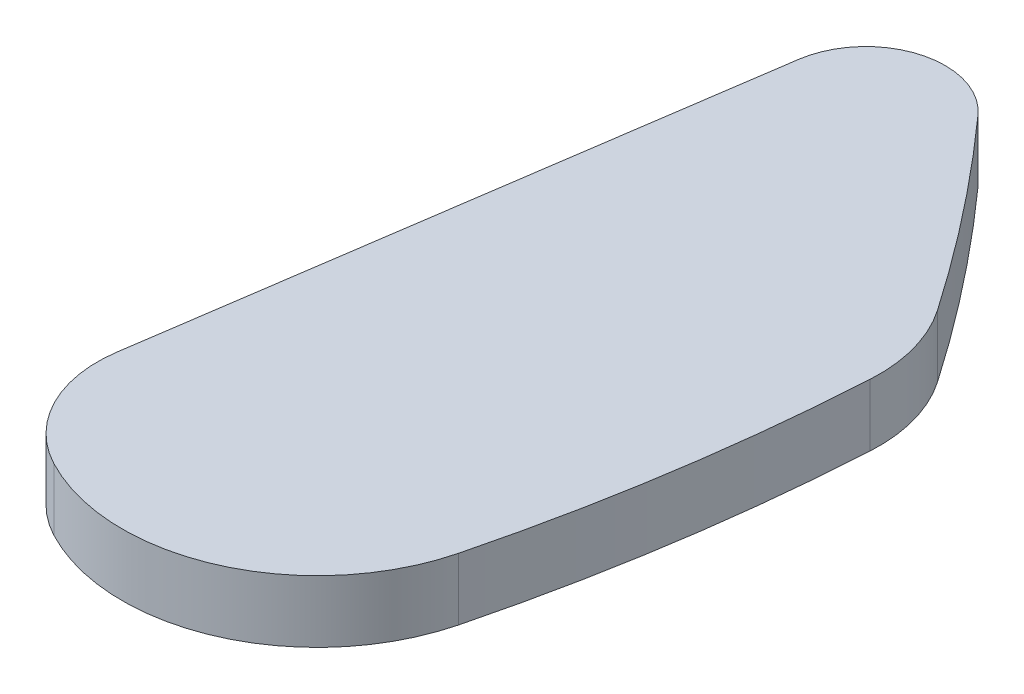
ISO-10303-21;
HEADER;
FILE_DESCRIPTION(('STEP AP214'),'2;1');
FILE_NAME('part.step','',(''),(''),'','','');
FILE_SCHEMA(('AUTOMOTIVE_DESIGN { 1 0 10303 214 1 1 1 1 }'));
ENDSEC;
DATA;
#1=APPLICATION_CONTEXT('core data for automotive mechanical design processes');
#2=APPLICATION_PROTOCOL_DEFINITION('international standard','automotive_design',2000,#1);
#3=PRODUCT_CONTEXT('',#1,'mechanical');
#4=PRODUCT('Part','Part','',(#3));
#5=PRODUCT_RELATED_PRODUCT_CATEGORY('part','',(#4));
#6=PRODUCT_DEFINITION_FORMATION('','',#4);
#7=PRODUCT_DEFINITION_CONTEXT('part definition',#1,'design');
#8=PRODUCT_DEFINITION('design','',#6,#7);
#9=PRODUCT_DEFINITION_SHAPE('','',#8);
#10=(LENGTH_UNIT() NAMED_UNIT(*) SI_UNIT(.MILLI.,.METRE.));
#11=(NAMED_UNIT(*) PLANE_ANGLE_UNIT() SI_UNIT($,.RADIAN.));
#12=(NAMED_UNIT(*) SI_UNIT($,.STERADIAN.) SOLID_ANGLE_UNIT());
#13=UNCERTAINTY_MEASURE_WITH_UNIT(LENGTH_MEASURE(1.E-05),#10,'distance_accuracy_value','');
#14=(GEOMETRIC_REPRESENTATION_CONTEXT(3) GLOBAL_UNCERTAINTY_ASSIGNED_CONTEXT((#13)) GLOBAL_UNIT_ASSIGNED_CONTEXT((#10,
#11,#12)) REPRESENTATION_CONTEXT('',''));
#15=CARTESIAN_POINT('',(0.,0.,0.));
#16=DIRECTION('',(0.,0.,1.));
#17=DIRECTION('',(1.,0.,0.));
#18=AXIS2_PLACEMENT_3D('',#15,#16,#17);
#19=CARTESIAN_POINT('',(-40.3314895013731,5.,-99.4168125159914));
#20=DIRECTION('',(0.,-1.,0.));
#21=DIRECTION('',(0.,0.,-1.));
#22=AXIS2_PLACEMENT_3D('',#19,#20,#21);
#23=CYLINDRICAL_SURFACE('',#22,10.);
#24=CARTESIAN_POINT('',(-40.3314895013731,0.,-99.4168125159914));
#25=DIRECTION('',(0.,1.,0.));
#26=DIRECTION('',(0.,0.,1.));
#27=AXIS2_PLACEMENT_3D('',#24,#25,#26);
#28=CIRCLE('',#27,10.);
#29=CARTESIAN_POINT('',(-50.2252395184647,0.,-100.870673100538));
#30=VERTEX_POINT('',#29);
#31=CARTESIAN_POINT('',(-45.0003727425401,0.,-90.5736496609745));
#32=VERTEX_POINT('',#31);
#33=EDGE_CURVE('E128',#30,#32,#28,.T.);
#34=ORIENTED_EDGE('',*,*,#33,.T.);
#35=DIRECTION('',(0.,-1.,0.));
#36=VECTOR('',#35,1.);
#37=CARTESIAN_POINT('',(-45.0003727425401,5.,-90.5736496609745));
#38=LINE('',#37,#36);
#39=CARTESIAN_POINT('',(-45.0003727425401,5.,-90.5736496609745));
#40=VERTEX_POINT('',#39);
#41=EDGE_CURVE('E11',#40,#32,#38,.T.);
#42=ORIENTED_EDGE('',*,*,#41,.F.);
#43=CARTESIAN_POINT('',(-40.3314895013731,5.,-99.4168125159914));
#44=DIRECTION('',(0.,1.,0.));
#45=DIRECTION('',(0.,0.,1.));
#46=AXIS2_PLACEMENT_3D('',#43,#44,#45);
#47=CIRCLE('',#46,10.);
#48=CARTESIAN_POINT('',(-50.2252395184647,5.,-100.870673100538));
#49=VERTEX_POINT('',#48);
#50=EDGE_CURVE('E140',#49,#40,#47,.T.);
#51=ORIENTED_EDGE('',*,*,#50,.F.);
#52=DIRECTION('',(0.,-1.,0.));
#53=VECTOR('',#52,1.);
#54=CARTESIAN_POINT('',(-50.2252395184647,5.,-100.870673100538));
#55=LINE('',#54,#53);
#56=EDGE_CURVE('E124',#49,#30,#55,.T.);
#57=ORIENTED_EDGE('',*,*,#56,.T.);
#58=EDGE_LOOP('',(#34,#42,#51,#57));
#59=FACE_BOUND('',#58,.T.);
#60=ADVANCED_FACE('F38',(#59),#23,.T.);
#61=CARTESIAN_POINT('',(-37.672058283321,5.,-104.453944983898));
#62=DIRECTION('',(0.,-1.,0.));
#63=DIRECTION('',(0.,0.,-1.));
#64=AXIS2_PLACEMENT_3D('',#61,#62,#63);
#65=CYLINDRICAL_SURFACE('',#64,15.6960756580995);
#66=CARTESIAN_POINT('',(-37.672058283321,0.,-104.453944983898));
#67=DIRECTION('',(0.,1.,0.));
#68=DIRECTION('',(0.,0.,-1.));
#69=AXIS2_PLACEMENT_3D('',#66,#67,#68);
#70=CIRCLE('',#69,15.6960756580995);
#71=CARTESIAN_POINT('',(-22.4565511628832,0.,-100.599709115054));
#72=VERTEX_POINT('',#71);
#73=EDGE_CURVE('E131',#32,#72,#70,.T.);
#74=ORIENTED_EDGE('',*,*,#73,.T.);
#75=DIRECTION('',(0.,-1.,0.));
#76=VECTOR('',#75,1.);
#77=CARTESIAN_POINT('',(-22.4565511628832,5.,-100.599709115054));
#78=LINE('',#77,#76);
#79=CARTESIAN_POINT('',(-22.4565511628832,5.,-100.599709115054));
#80=VERTEX_POINT('',#79);
#81=EDGE_CURVE('E46',#80,#72,#78,.T.);
#82=ORIENTED_EDGE('',*,*,#81,.F.);
#83=CARTESIAN_POINT('',(-37.672058283321,5.,-104.453944983898));
#84=DIRECTION('',(0.,1.,0.));
#85=DIRECTION('',(0.,0.,-1.));
#86=AXIS2_PLACEMENT_3D('',#83,#84,#85);
#87=CIRCLE('',#86,15.6960756580995);
#88=EDGE_CURVE('E94',#40,#80,#87,.T.);
#89=ORIENTED_EDGE('',*,*,#88,.F.);
#90=ORIENTED_EDGE('',*,*,#41,.T.);
#91=EDGE_LOOP('',(#74,#82,#89,#90));
#92=FACE_BOUND('',#91,.T.);
#93=ADVANCED_FACE('F165',(#92),#65,.T.);
#94=CARTESIAN_POINT('',(-171.2572125516,5.,-138.292363187831));
#95=DIRECTION('',(0.,-1.,0.));
#96=DIRECTION('',(0.,0.,-1.));
#97=AXIS2_PLACEMENT_3D('',#94,#95,#96);
#98=CYLINDRICAL_SURFACE('',#97,153.500400653449);
#99=CARTESIAN_POINT('',(-171.2572125516,0.,-138.292363187831));
#100=DIRECTION('',(0.,1.,0.));
#101=DIRECTION('',(0.,0.,1.));
#102=AXIS2_PLACEMENT_3D('',#99,#100,#101);
#103=CIRCLE('',#102,153.500400653449);
#104=CARTESIAN_POINT('',(-18.0206236675566,0.,-129.296762710251));
#105=VERTEX_POINT('',#104);
#106=EDGE_CURVE('E133',#72,#105,#103,.T.);
#107=ORIENTED_EDGE('',*,*,#106,.T.);
#108=DIRECTION('',(0.,-1.,0.));
#109=VECTOR('',#108,1.);
#110=CARTESIAN_POINT('',(-18.0206236675566,5.,-129.296762710251));
#111=LINE('',#110,#109);
#112=CARTESIAN_POINT('',(-18.0206236675566,5.,-129.296762710251));
#113=VERTEX_POINT('',#112);
#114=EDGE_CURVE('E144',#113,#105,#111,.T.);
#115=ORIENTED_EDGE('',*,*,#114,.F.);
#116=CARTESIAN_POINT('',(-171.2572125516,5.,-138.292363187831));
#117=DIRECTION('',(0.,1.,0.));
#118=DIRECTION('',(0.,0.,1.));
#119=AXIS2_PLACEMENT_3D('',#116,#117,#118);
#120=CIRCLE('',#119,153.500400653449);
#121=EDGE_CURVE('E152',#80,#113,#120,.T.);
#122=ORIENTED_EDGE('',*,*,#121,.F.);
#123=ORIENTED_EDGE('',*,*,#81,.T.);
#124=EDGE_LOOP('',(#107,#115,#122,#123));
#125=FACE_BOUND('',#124,.T.);
#126=ADVANCED_FACE('F150',(#125),#98,.T.);
#127=CARTESIAN_POINT('',(-30.,5.,-130.));
#128=DIRECTION('',(0.,-1.,0.));
#129=DIRECTION('',(0.,0.,-1.));
#130=AXIS2_PLACEMENT_3D('',#127,#128,#129);
#131=CYLINDRICAL_SURFACE('',#130,12.);
#132=CARTESIAN_POINT('',(-30.,0.,-130.));
#133=DIRECTION('',(0.,1.,0.));
#134=DIRECTION('',(0.,0.,1.));
#135=AXIS2_PLACEMENT_3D('',#132,#133,#134);
#136=CIRCLE('',#135,12.);
#137=CARTESIAN_POINT('',(-20.1163991974912,0.,-136.805470973904));
#138=VERTEX_POINT('',#137);
#139=EDGE_CURVE('E135',#105,#138,#136,.T.);
#140=ORIENTED_EDGE('',*,*,#139,.T.);
#141=DIRECTION('',(0.,-1.,0.));
#142=VECTOR('',#141,1.);
#143=CARTESIAN_POINT('',(-20.1163991974912,5.,-136.805470973904));
#144=LINE('',#143,#142);
#145=CARTESIAN_POINT('',(-20.1163991974912,5.,-136.805470973904));
#146=VERTEX_POINT('',#145);
#147=EDGE_CURVE('E119',#146,#138,#144,.T.);
#148=ORIENTED_EDGE('',*,*,#147,.F.);
#149=CARTESIAN_POINT('',(-30.,5.,-130.));
#150=DIRECTION('',(0.,1.,0.));
#151=DIRECTION('',(0.,0.,1.));
#152=AXIS2_PLACEMENT_3D('',#149,#150,#151);
#153=CIRCLE('',#152,12.);
#154=EDGE_CURVE('E110',#113,#146,#153,.T.);
#155=ORIENTED_EDGE('',*,*,#154,.F.);
#156=ORIENTED_EDGE('',*,*,#114,.T.);
#157=EDGE_LOOP('',(#140,#148,#155,#156));
#158=FACE_BOUND('',#157,.T.);
#159=ADVANCED_FACE('F158',(#158),#131,.T.);
#160=CARTESIAN_POINT('',(-146.544456121145,5.,-49.7519275464318));
#161=DIRECTION('',(0.,-1.,0.));
#162=DIRECTION('',(0.,0.,-1.));
#163=AXIS2_PLACEMENT_3D('',#160,#161,#162);
#164=CYLINDRICAL_SURFACE('',#163,153.500400653449);
#165=CARTESIAN_POINT('',(-146.544456121145,0.,-49.7519275464318));
#166=DIRECTION('',(0.,1.,0.));
#167=DIRECTION('',(0.,0.,1.));
#168=AXIS2_PLACEMENT_3D('',#165,#166,#167);
#169=CIRCLE('',#168,153.500400653449);
#170=CARTESIAN_POINT('',(-32.0981244877031,0.,-152.047627243035));
#171=VERTEX_POINT('',#170);
#172=EDGE_CURVE('E118',#138,#171,#169,.T.);
#173=ORIENTED_EDGE('',*,*,#172,.T.);
#174=DIRECTION('',(0.,-1.,0.));
#175=VECTOR('',#174,1.);
#176=CARTESIAN_POINT('',(-32.0981244877031,5.,-152.047627243035));
#177=LINE('',#176,#175);
#178=CARTESIAN_POINT('',(-32.0981244877031,5.,-152.047627243035));
#179=VERTEX_POINT('',#178);
#180=EDGE_CURVE('E115',#179,#171,#177,.T.);
#181=ORIENTED_EDGE('',*,*,#180,.F.);
#182=CARTESIAN_POINT('',(-146.544456121145,5.,-49.7519275464318));
#183=DIRECTION('',(0.,1.,0.));
#184=DIRECTION('',(0.,0.,1.));
#185=AXIS2_PLACEMENT_3D('',#182,#183,#184);
#186=CIRCLE('',#185,153.500400653449);
#187=EDGE_CURVE('E104',#146,#179,#186,.T.);
#188=ORIENTED_EDGE('',*,*,#187,.F.);
#189=ORIENTED_EDGE('',*,*,#147,.T.);
#190=EDGE_LOOP('',(#173,#181,#188,#189));
#191=FACE_BOUND('',#190,.T.);
#192=ADVANCED_FACE('F116',(#191),#164,.T.);
#193=CARTESIAN_POINT('',(-36.8667216390966,5.,-147.785306422343));
#194=DIRECTION('',(0.,-1.,0.));
#195=DIRECTION('',(0.,0.,-1.));
#196=AXIS2_PLACEMENT_3D('',#193,#194,#195);
#197=CYLINDRICAL_SURFACE('',#196,6.39585002722699);
#198=CARTESIAN_POINT('',(-36.8667216390966,0.,-147.785306422343));
#199=DIRECTION('',(0.,1.,0.));
#200=DIRECTION('',(0.,0.,1.));
#201=AXIS2_PLACEMENT_3D('',#198,#199,#200);
#202=CIRCLE('',#201,6.39585002722699);
#203=CARTESIAN_POINT('',(-43.1946157707158,0.,-148.715173848269));
#204=VERTEX_POINT('',#203);
#205=EDGE_CURVE('E80',#171,#204,#202,.T.);
#206=ORIENTED_EDGE('',*,*,#205,.T.);
#207=DIRECTION('',(0.,-1.,0.));
#208=VECTOR('',#207,1.);
#209=CARTESIAN_POINT('',(-43.1946157707158,5.,-148.715173848269));
#210=LINE('',#209,#208);
#211=CARTESIAN_POINT('',(-43.1946157707158,5.,-148.715173848269));
#212=VERTEX_POINT('',#211);
#213=EDGE_CURVE('E120',#212,#204,#210,.T.);
#214=ORIENTED_EDGE('',*,*,#213,.F.);
#215=CARTESIAN_POINT('',(-36.8667216390966,5.,-147.785306422343));
#216=DIRECTION('',(0.,1.,0.));
#217=DIRECTION('',(0.,0.,1.));
#218=AXIS2_PLACEMENT_3D('',#215,#216,#217);
#219=CIRCLE('',#218,6.39585002722699);
#220=EDGE_CURVE('E108',#179,#212,#219,.T.);
#221=ORIENTED_EDGE('',*,*,#220,.F.);
#222=ORIENTED_EDGE('',*,*,#180,.T.);
#223=EDGE_LOOP('',(#206,#214,#221,#222));
#224=FACE_BOUND('',#223,.T.);
#225=ADVANCED_FACE('F122',(#224),#197,.T.);
#226=CARTESIAN_POINT('',(-43.1946157707158,5.,-148.715173848269));
#227=DIRECTION('',(0.989375001709163,0.,0.145386058454699));
#228=DIRECTION('',(0.145386058454699,0.,-0.989375001709163));
#229=AXIS2_PLACEMENT_3D('',#226,#227,#228);
#230=PLANE('',#229);
#231=DIRECTION('',(-0.145386058454699,0.,0.989375001709163));
#232=VECTOR('',#231,1.);
#233=CARTESIAN_POINT('',(-43.1946157707158,0.,-148.715173848269));
#234=LINE('',#233,#232);
#235=EDGE_CURVE('E86',#204,#30,#234,.T.);
#236=ORIENTED_EDGE('',*,*,#235,.T.);
#237=ORIENTED_EDGE('',*,*,#56,.F.);
#238=DIRECTION('',(-0.145386058454699,0.,0.989375001709163));
#239=VECTOR('',#238,1.);
#240=CARTESIAN_POINT('',(-43.1946157707158,5.,-148.715173848269));
#241=LINE('',#240,#239);
#242=EDGE_CURVE('E54',#212,#49,#241,.T.);
#243=ORIENTED_EDGE('',*,*,#242,.F.);
#244=ORIENTED_EDGE('',*,*,#213,.T.);
#245=EDGE_LOOP('',(#236,#237,#243,#244));
#246=FACE_BOUND('',#245,.T.);
#247=ADVANCED_FACE('F179',(#246),#230,.F.);
#248=CARTESIAN_POINT('',(-40.3314895013731,5.,-99.4168125159914));
#249=DIRECTION('',(0.,1.,0.));
#250=DIRECTION('',(0.,0.,1.));
#251=AXIS2_PLACEMENT_3D('',#248,#249,#250);
#252=PLANE('',#251);
#253=ORIENTED_EDGE('',*,*,#50,.T.);
#254=ORIENTED_EDGE('',*,*,#88,.T.);
#255=ORIENTED_EDGE('',*,*,#121,.T.);
#256=ORIENTED_EDGE('',*,*,#154,.T.);
#257=ORIENTED_EDGE('',*,*,#187,.T.);
#258=ORIENTED_EDGE('',*,*,#220,.T.);
#259=ORIENTED_EDGE('',*,*,#242,.T.);
#260=EDGE_LOOP('',(#253,#254,#255,#256,#257,#258,#259));
#261=FACE_BOUND('',#260,.T.);
#262=ADVANCED_FACE('F106',(#261),#252,.T.);
#263=CARTESIAN_POINT('',(-40.3314895013731,0.,-99.4168125159914));
#264=DIRECTION('',(0.,1.,0.));
#265=DIRECTION('',(0.,0.,1.));
#266=AXIS2_PLACEMENT_3D('',#263,#264,#265);
#267=PLANE('',#266);
#268=ORIENTED_EDGE('',*,*,#33,.F.);
#269=ORIENTED_EDGE('',*,*,#235,.F.);
#270=ORIENTED_EDGE('',*,*,#205,.F.);
#271=ORIENTED_EDGE('',*,*,#172,.F.);
#272=ORIENTED_EDGE('',*,*,#139,.F.);
#273=ORIENTED_EDGE('',*,*,#106,.F.);
#274=ORIENTED_EDGE('',*,*,#73,.F.);
#275=EDGE_LOOP('',(#268,#269,#270,#271,#272,#273,#274));
#276=FACE_BOUND('',#275,.T.);
#277=ADVANCED_FACE('F156',(#276),#267,.F.);
#278=CLOSED_SHELL('',(#60,#93,#126,#159,#192,#225,#247,#262,#277));
#279=MANIFOLD_SOLID_BREP('B2',#278);
#280=ADVANCED_BREP_SHAPE_REPRESENTATION('',(#18,#279),#14);
#281=SHAPE_DEFINITION_REPRESENTATION(#9,#280);
ENDSEC;
END-ISO-10303-21;
